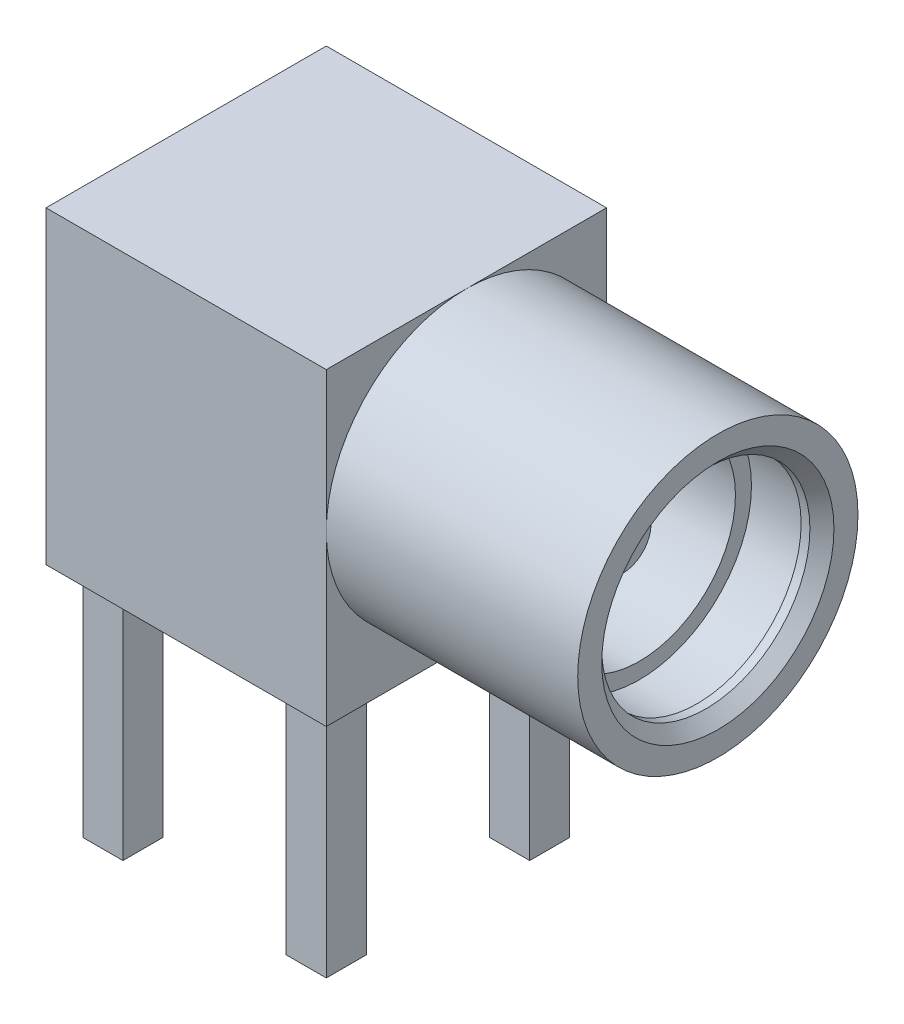
ISO-10303-21;
HEADER;
FILE_DESCRIPTION(('STEP AP214'),'2;1');
FILE_NAME('part.step','',(''),(''),'','','');
FILE_SCHEMA(('AUTOMOTIVE_DESIGN { 1 0 10303 214 1 1 1 1 }'));
ENDSEC;
DATA;
#1=APPLICATION_CONTEXT('core data for automotive mechanical design processes');
#2=APPLICATION_PROTOCOL_DEFINITION('international standard','automotive_design',2000,#1);
#3=PRODUCT_CONTEXT('',#1,'mechanical');
#4=PRODUCT('Part','Part','',(#3));
#5=PRODUCT_RELATED_PRODUCT_CATEGORY('part','',(#4));
#6=PRODUCT_DEFINITION_FORMATION('','',#4);
#7=PRODUCT_DEFINITION_CONTEXT('part definition',#1,'design');
#8=PRODUCT_DEFINITION('design','',#6,#7);
#9=PRODUCT_DEFINITION_SHAPE('','',#8);
#10=(LENGTH_UNIT() NAMED_UNIT(*) SI_UNIT(.MILLI.,.METRE.));
#11=(NAMED_UNIT(*) PLANE_ANGLE_UNIT() SI_UNIT($,.RADIAN.));
#12=(NAMED_UNIT(*) SI_UNIT($,.STERADIAN.) SOLID_ANGLE_UNIT());
#13=UNCERTAINTY_MEASURE_WITH_UNIT(LENGTH_MEASURE(1.E-05),#10,'distance_accuracy_value','');
#14=(GEOMETRIC_REPRESENTATION_CONTEXT(3) GLOBAL_UNCERTAINTY_ASSIGNED_CONTEXT((#13)) GLOBAL_UNIT_ASSIGNED_CONTEXT((#10,
#11,#12)) REPRESENTATION_CONTEXT('',''));
#15=CARTESIAN_POINT('',(0.,0.,0.));
#16=DIRECTION('',(0.,0.,1.));
#17=DIRECTION('',(1.,0.,0.));
#18=AXIS2_PLACEMENT_3D('',#15,#16,#17);
#19=CARTESIAN_POINT('',(41.5125000000001,-45.7600000000006,24.29));
#20=DIRECTION('',(0.,-1.,0.));
#21=DIRECTION('',(0.,0.,-1.));
#22=AXIS2_PLACEMENT_3D('',#19,#20,#21);
#23=PLANE('',#22);
#24=CARTESIAN_POINT('',(39.7625000000001,-45.7600000000006,22.54));
#25=DIRECTION('',(0.,-1.,0.));
#26=DIRECTION('',(0.,0.,-1.));
#27=AXIS2_PLACEMENT_3D('',#24,#25,#26);
#28=CIRCLE('',#27,0.355000000007009);
#29=CARTESIAN_POINT('',(39.7625000000001,-45.7600000000006,22.184999999993));
#30=VERTEX_POINT('',#29);
#31=EDGE_CURVE('E11',#30,#30,#28,.T.);
#32=ORIENTED_EDGE('',*,*,#31,.F.);
#33=EDGE_LOOP('',(#32));
#34=FACE_BOUND('',#33,.T.);
#35=DIRECTION('',(-1.,0.,0.));
#36=VECTOR('',#35,1.);
#37=CARTESIAN_POINT('',(41.5125000000001,-45.7600000000006,20.79));
#38=LINE('',#37,#36);
#39=CARTESIAN_POINT('',(41.5125000000001,-45.7600000000006,20.79));
#40=VERTEX_POINT('',#39);
#41=CARTESIAN_POINT('',(38.0125000000001,-45.7600000000006,20.79));
#42=VERTEX_POINT('',#41);
#43=EDGE_CURVE('E305',#40,#42,#38,.T.);
#44=ORIENTED_EDGE('',*,*,#43,.F.);
#45=DIRECTION('',(0.,0.,-1.));
#46=VECTOR('',#45,1.);
#47=CARTESIAN_POINT('',(41.5125000000001,-45.7600000000006,24.29));
#48=LINE('',#47,#46);
#49=CARTESIAN_POINT('',(41.5125000000001,-45.7600000000006,24.29));
#50=VERTEX_POINT('',#49);
#51=EDGE_CURVE('E328',#50,#40,#48,.T.);
#52=ORIENTED_EDGE('',*,*,#51,.F.);
#53=DIRECTION('',(-1.,0.,0.));
#54=VECTOR('',#53,1.);
#55=CARTESIAN_POINT('',(41.5125000000001,-45.7600000000006,24.29));
#56=LINE('',#55,#54);
#57=CARTESIAN_POINT('',(38.0125000000001,-45.7600000000006,24.29));
#58=VERTEX_POINT('',#57);
#59=EDGE_CURVE('E312',#50,#58,#56,.T.);
#60=ORIENTED_EDGE('',*,*,#59,.T.);
#61=DIRECTION('',(0.,0.,-1.));
#62=VECTOR('',#61,1.);
#63=CARTESIAN_POINT('',(38.0125000000001,-45.7600000000006,24.29));
#64=LINE('',#63,#62);
#65=EDGE_CURVE('E326',#58,#42,#64,.T.);
#66=ORIENTED_EDGE('',*,*,#65,.T.);
#67=EDGE_LOOP('',(#44,#52,#60,#66));
#68=FACE_BOUND('',#67,.T.);
#69=DIRECTION('',(0.,0.,-1.));
#70=VECTOR('',#69,1.);
#71=CARTESIAN_POINT('',(38.2425000000001,-45.7600000000006,23.56));
#72=LINE('',#71,#70);
#73=CARTESIAN_POINT('',(38.2425000000001,-45.7600000000006,24.06));
#74=VERTEX_POINT('',#73);
#75=CARTESIAN_POINT('',(38.2425000000001,-45.7600000000006,23.56));
#76=VERTEX_POINT('',#75);
#77=EDGE_CURVE('E278',#74,#76,#72,.T.);
#78=ORIENTED_EDGE('',*,*,#77,.F.);
#79=DIRECTION('',(-1.,0.,0.));
#80=VECTOR('',#79,1.);
#81=CARTESIAN_POINT('',(38.2425000000001,-45.7600000000006,24.06));
#82=LINE('',#81,#80);
#83=CARTESIAN_POINT('',(38.7425000000001,-45.7600000000006,24.06));
#84=VERTEX_POINT('',#83);
#85=EDGE_CURVE('E264',#84,#74,#82,.T.);
#86=ORIENTED_EDGE('',*,*,#85,.F.);
#87=DIRECTION('',(0.,0.,1.));
#88=VECTOR('',#87,1.);
#89=CARTESIAN_POINT('',(38.7425000000001,-45.7600000000006,24.06));
#90=LINE('',#89,#88);
#91=CARTESIAN_POINT('',(38.7425000000001,-45.7600000000006,23.56));
#92=VERTEX_POINT('',#91);
#93=EDGE_CURVE('E269',#92,#84,#90,.T.);
#94=ORIENTED_EDGE('',*,*,#93,.F.);
#95=DIRECTION('',(1.,0.,0.));
#96=VECTOR('',#95,1.);
#97=CARTESIAN_POINT('',(38.7425000000001,-45.7600000000006,23.56));
#98=LINE('',#97,#96);
#99=EDGE_CURVE('E280',#76,#92,#98,.T.);
#100=ORIENTED_EDGE('',*,*,#99,.F.);
#101=EDGE_LOOP('',(#78,#86,#94,#100));
#102=FACE_BOUND('',#101,.T.);
#103=DIRECTION('',(0.,0.,-1.));
#104=VECTOR('',#103,1.);
#105=CARTESIAN_POINT('',(40.7825000000001,-45.7600000000006,21.02));
#106=LINE('',#105,#104);
#107=CARTESIAN_POINT('',(40.7825000000001,-45.7600000000006,21.52));
#108=VERTEX_POINT('',#107);
#109=CARTESIAN_POINT('',(40.7825000000001,-45.7600000000006,21.02));
#110=VERTEX_POINT('',#109);
#111=EDGE_CURVE('E249',#108,#110,#106,.T.);
#112=ORIENTED_EDGE('',*,*,#111,.F.);
#113=DIRECTION('',(-1.,0.,0.));
#114=VECTOR('',#113,1.);
#115=CARTESIAN_POINT('',(40.7825000000001,-45.7600000000006,21.52));
#116=LINE('',#115,#114);
#117=CARTESIAN_POINT('',(41.2825000000001,-45.7600000000006,21.52));
#118=VERTEX_POINT('',#117);
#119=EDGE_CURVE('E235',#118,#108,#116,.T.);
#120=ORIENTED_EDGE('',*,*,#119,.F.);
#121=DIRECTION('',(0.,0.,1.));
#122=VECTOR('',#121,1.);
#123=CARTESIAN_POINT('',(41.2825000000001,-45.7600000000006,21.52));
#124=LINE('',#123,#122);
#125=CARTESIAN_POINT('',(41.2825000000001,-45.7600000000006,21.02));
#126=VERTEX_POINT('',#125);
#127=EDGE_CURVE('E240',#126,#118,#124,.T.);
#128=ORIENTED_EDGE('',*,*,#127,.F.);
#129=DIRECTION('',(1.,0.,0.));
#130=VECTOR('',#129,1.);
#131=CARTESIAN_POINT('',(41.2825000000001,-45.7600000000006,21.02));
#132=LINE('',#131,#130);
#133=EDGE_CURVE('E251',#110,#126,#132,.T.);
#134=ORIENTED_EDGE('',*,*,#133,.F.);
#135=EDGE_LOOP('',(#112,#120,#128,#134));
#136=FACE_BOUND('',#135,.T.);
#137=DIRECTION('',(0.,0.,-1.));
#138=VECTOR('',#137,1.);
#139=CARTESIAN_POINT('',(38.2425000000001,-45.7600000000006,21.02));
#140=LINE('',#139,#138);
#141=CARTESIAN_POINT('',(38.2425000000001,-45.7600000000006,21.52));
#142=VERTEX_POINT('',#141);
#143=CARTESIAN_POINT('',(38.2425000000001,-45.7600000000006,21.02));
#144=VERTEX_POINT('',#143);
#145=EDGE_CURVE('E207',#142,#144,#140,.T.);
#146=ORIENTED_EDGE('',*,*,#145,.F.);
#147=DIRECTION('',(-1.,0.,0.));
#148=VECTOR('',#147,1.);
#149=CARTESIAN_POINT('',(38.2425000000001,-45.7600000000006,21.52));
#150=LINE('',#149,#148);
#151=CARTESIAN_POINT('',(38.7425000000001,-45.7600000000006,21.52));
#152=VERTEX_POINT('',#151);
#153=EDGE_CURVE('E204',#152,#142,#150,.T.);
#154=ORIENTED_EDGE('',*,*,#153,.F.);
#155=DIRECTION('',(0.,0.,1.));
#156=VECTOR('',#155,1.);
#157=CARTESIAN_POINT('',(38.7425000000001,-45.7600000000006,21.52));
#158=LINE('',#157,#156);
#159=CARTESIAN_POINT('',(38.7425000000001,-45.7600000000006,21.02));
#160=VERTEX_POINT('',#159);
#161=EDGE_CURVE('E216',#160,#152,#158,.T.);
#162=ORIENTED_EDGE('',*,*,#161,.F.);
#163=DIRECTION('',(1.,0.,0.));
#164=VECTOR('',#163,1.);
#165=CARTESIAN_POINT('',(38.7425000000001,-45.7600000000006,21.02));
#166=LINE('',#165,#164);
#167=EDGE_CURVE('E224',#144,#160,#166,.T.);
#168=ORIENTED_EDGE('',*,*,#167,.F.);
#169=EDGE_LOOP('',(#146,#154,#162,#168));
#170=FACE_BOUND('',#169,.T.);
#171=DIRECTION('',(0.,0.,-1.));
#172=VECTOR('',#171,1.);
#173=CARTESIAN_POINT('',(40.7825000000001,-45.7600000000006,23.56));
#174=LINE('',#173,#172);
#175=CARTESIAN_POINT('',(40.7825000000001,-45.7600000000006,24.06));
#176=VERTEX_POINT('',#175);
#177=CARTESIAN_POINT('',(40.7825000000001,-45.7600000000006,23.56));
#178=VERTEX_POINT('',#177);
#179=EDGE_CURVE('E770',#176,#178,#174,.T.);
#180=ORIENTED_EDGE('',*,*,#179,.F.);
#181=DIRECTION('',(-1.,0.,0.));
#182=VECTOR('',#181,1.);
#183=CARTESIAN_POINT('',(40.7825000000001,-45.7600000000006,24.06));
#184=LINE('',#183,#182);
#185=CARTESIAN_POINT('',(41.2825000000001,-45.7600000000006,24.06));
#186=VERTEX_POINT('',#185);
#187=EDGE_CURVE('E202',#186,#176,#184,.T.);
#188=ORIENTED_EDGE('',*,*,#187,.F.);
#189=DIRECTION('',(0.,0.,1.));
#190=VECTOR('',#189,1.);
#191=CARTESIAN_POINT('',(41.2825000000001,-45.7600000000006,24.06));
#192=LINE('',#191,#190);
#193=CARTESIAN_POINT('',(41.2825000000001,-45.7600000000006,23.56));
#194=VERTEX_POINT('',#193);
#195=EDGE_CURVE('E198',#194,#186,#192,.T.);
#196=ORIENTED_EDGE('',*,*,#195,.F.);
#197=DIRECTION('',(1.,0.,0.));
#198=VECTOR('',#197,1.);
#199=CARTESIAN_POINT('',(41.2825000000001,-45.7600000000006,23.56));
#200=LINE('',#199,#198);
#201=EDGE_CURVE('E772',#178,#194,#200,.T.);
#202=ORIENTED_EDGE('',*,*,#201,.F.);
#203=EDGE_LOOP('',(#180,#188,#196,#202));
#204=FACE_BOUND('',#203,.T.);
#205=ADVANCED_FACE('F32',(#34,#68,#102,#136,#170,#204),#23,.T.);
#206=CARTESIAN_POINT('',(41.5125000000001,-41.9000000000005,24.29));
#207=DIRECTION('',(1.,0.,0.));
#208=DIRECTION('',(0.,0.,-1.));
#209=AXIS2_PLACEMENT_3D('',#206,#207,#208);
#210=PLANE('',#209);
#211=CARTESIAN_POINT('',(41.5125000000001,-43.6500000000006,22.54));
#212=DIRECTION('',(1.,0.,0.));
#213=DIRECTION('',(0.,0.,-1.));
#214=AXIS2_PLACEMENT_3D('',#211,#212,#213);
#215=CIRCLE('',#214,1.75);
#216=CARTESIAN_POINT('',(41.5125000000001,-43.6500000000006,20.79));
#217=VERTEX_POINT('',#216);
#218=CARTESIAN_POINT('',(41.5125000000001,-41.9000000000005,22.54));
#219=VERTEX_POINT('',#218);
#220=EDGE_CURVE('E293',#217,#219,#215,.T.);
#221=ORIENTED_EDGE('',*,*,#220,.F.);
#222=DIRECTION('',(0.,-1.,0.));
#223=VECTOR('',#222,1.);
#224=CARTESIAN_POINT('',(41.5125000000001,-41.9000000000005,20.79));
#225=LINE('',#224,#223);
#226=CARTESIAN_POINT('',(41.5125000000001,-41.9000000000005,20.79));
#227=VERTEX_POINT('',#226);
#228=EDGE_CURVE('E322',#227,#217,#225,.T.);
#229=ORIENTED_EDGE('',*,*,#228,.F.);
#230=DIRECTION('',(0.,0.,-1.));
#231=VECTOR('',#230,1.);
#232=CARTESIAN_POINT('',(41.5125000000001,-41.9000000000005,24.29));
#233=LINE('',#232,#231);
#234=EDGE_CURVE('E333',#219,#227,#233,.T.);
#235=ORIENTED_EDGE('',*,*,#234,.F.);
#236=EDGE_LOOP('',(#221,#229,#235));
#237=FACE_BOUND('',#236,.T.);
#238=ADVANCED_FACE('F343',(#237),#210,.T.);
#239=CARTESIAN_POINT('',(41.5125000000001,-43.6500000000006,24.29));
#240=VERTEX_POINT('',#239);
#241=EDGE_CURVE('E40',#219,#240,#215,.T.);
#242=ORIENTED_EDGE('',*,*,#241,.F.);
#243=CARTESIAN_POINT('',(41.5125000000001,-41.9000000000005,24.29));
#244=VERTEX_POINT('',#243);
#245=EDGE_CURVE('E331',#244,#219,#233,.T.);
#246=ORIENTED_EDGE('',*,*,#245,.F.);
#247=DIRECTION('',(0.,-1.,0.));
#248=VECTOR('',#247,1.);
#249=CARTESIAN_POINT('',(41.5125000000001,-41.9000000000005,24.29));
#250=LINE('',#249,#248);
#251=EDGE_CURVE('E309',#244,#240,#250,.T.);
#252=ORIENTED_EDGE('',*,*,#251,.T.);
#253=EDGE_LOOP('',(#242,#246,#252));
#254=FACE_BOUND('',#253,.T.);
#255=ADVANCED_FACE('F363',(#254),#210,.T.);
#256=CARTESIAN_POINT('',(38.0125000000001,-45.7600000000006,24.29));
#257=DIRECTION('',(-1.,0.,0.));
#258=DIRECTION('',(0.,0.,1.));
#259=AXIS2_PLACEMENT_3D('',#256,#257,#258);
#260=PLANE('',#259);
#261=DIRECTION('',(0.,1.,0.));
#262=VECTOR('',#261,1.);
#263=CARTESIAN_POINT('',(38.0125000000001,-45.7600000000006,20.79));
#264=LINE('',#263,#262);
#265=CARTESIAN_POINT('',(38.0125000000001,-41.9000000000005,20.79));
#266=VERTEX_POINT('',#265);
#267=EDGE_CURVE('E297',#42,#266,#264,.T.);
#268=ORIENTED_EDGE('',*,*,#267,.F.);
#269=ORIENTED_EDGE('',*,*,#65,.F.);
#270=DIRECTION('',(0.,1.,0.));
#271=VECTOR('',#270,1.);
#272=CARTESIAN_POINT('',(38.0125000000001,-45.7600000000006,24.29));
#273=LINE('',#272,#271);
#274=CARTESIAN_POINT('',(38.0125000000001,-41.9000000000005,24.29));
#275=VERTEX_POINT('',#274);
#276=EDGE_CURVE('E301',#58,#275,#273,.T.);
#277=ORIENTED_EDGE('',*,*,#276,.T.);
#278=DIRECTION('',(0.,0.,-1.));
#279=VECTOR('',#278,1.);
#280=CARTESIAN_POINT('',(38.0125000000001,-41.9000000000005,24.29));
#281=LINE('',#280,#279);
#282=EDGE_CURVE('E315',#275,#266,#281,.T.);
#283=ORIENTED_EDGE('',*,*,#282,.T.);
#284=EDGE_LOOP('',(#268,#269,#277,#283));
#285=FACE_BOUND('',#284,.T.);
#286=ADVANCED_FACE('F34',(#285),#260,.T.);
#287=EDGE_CURVE('E300',#240,#217,#215,.T.);
#288=ORIENTED_EDGE('',*,*,#287,.F.);
#289=EDGE_CURVE('E308',#240,#50,#250,.T.);
#290=ORIENTED_EDGE('',*,*,#289,.T.);
#291=ORIENTED_EDGE('',*,*,#51,.T.);
#292=EDGE_CURVE('E321',#217,#40,#225,.T.);
#293=ORIENTED_EDGE('',*,*,#292,.F.);
#294=EDGE_LOOP('',(#288,#290,#291,#293));
#295=FACE_BOUND('',#294,.T.);
#296=ADVANCED_FACE('F360',(#295),#210,.T.);
#297=CARTESIAN_POINT('',(38.0125000000001,-41.9000000000005,24.29));
#298=DIRECTION('',(0.,1.,0.));
#299=DIRECTION('',(0.,0.,1.));
#300=AXIS2_PLACEMENT_3D('',#297,#298,#299);
#301=PLANE('',#300);
#302=DIRECTION('',(1.,0.,0.));
#303=VECTOR('',#302,1.);
#304=CARTESIAN_POINT('',(38.0125000000001,-41.9000000000005,20.79));
#305=LINE('',#304,#303);
#306=EDGE_CURVE('E318',#266,#227,#305,.T.);
#307=ORIENTED_EDGE('',*,*,#306,.F.);
#308=ORIENTED_EDGE('',*,*,#282,.F.);
#309=DIRECTION('',(1.,0.,0.));
#310=VECTOR('',#309,1.);
#311=CARTESIAN_POINT('',(38.0125000000001,-41.9000000000005,24.29));
#312=LINE('',#311,#310);
#313=EDGE_CURVE('E304',#275,#244,#312,.T.);
#314=ORIENTED_EDGE('',*,*,#313,.T.);
#315=ORIENTED_EDGE('',*,*,#245,.T.);
#316=ORIENTED_EDGE('',*,*,#234,.T.);
#317=EDGE_LOOP('',(#307,#308,#314,#315,#316));
#318=FACE_BOUND('',#317,.T.);
#319=ADVANCED_FACE('F340',(#318),#301,.T.);
#320=CARTESIAN_POINT('',(0.,0.,24.2900000000001));
#321=DIRECTION('',(0.,0.,-1.));
#322=DIRECTION('',(-1.,0.,0.));
#323=AXIS2_PLACEMENT_3D('',#320,#321,#322);
#324=PLANE('',#323);
#325=ORIENTED_EDGE('',*,*,#276,.F.);
#326=ORIENTED_EDGE('',*,*,#59,.F.);
#327=ORIENTED_EDGE('',*,*,#289,.F.);
#328=ORIENTED_EDGE('',*,*,#251,.F.);
#329=ORIENTED_EDGE('',*,*,#313,.F.);
#330=EDGE_LOOP('',(#325,#326,#327,#328,#329));
#331=FACE_BOUND('',#330,.T.);
#332=ADVANCED_FACE('F354',(#331),#324,.F.);
#333=CARTESIAN_POINT('',(0.,0.,20.7900000000001));
#334=DIRECTION('',(0.,0.,-1.));
#335=DIRECTION('',(-1.,0.,0.));
#336=AXIS2_PLACEMENT_3D('',#333,#334,#335);
#337=PLANE('',#336);
#338=ORIENTED_EDGE('',*,*,#267,.T.);
#339=ORIENTED_EDGE('',*,*,#306,.T.);
#340=ORIENTED_EDGE('',*,*,#228,.T.);
#341=ORIENTED_EDGE('',*,*,#292,.T.);
#342=ORIENTED_EDGE('',*,*,#43,.T.);
#343=EDGE_LOOP('',(#338,#339,#340,#341,#342));
#344=FACE_BOUND('',#343,.T.);
#345=ADVANCED_FACE('F347',(#344),#337,.T.);
#346=CARTESIAN_POINT('',(44.6525000000001,-43.6500000000006,22.54));
#347=DIRECTION('',(-1.,0.,0.));
#348=DIRECTION('',(0.,0.,1.));
#349=AXIS2_PLACEMENT_3D('',#346,#347,#348);
#350=CYLINDRICAL_SURFACE('',#349,1.75);
#351=CARTESIAN_POINT('',(44.6525000000001,-43.6500000000006,22.54));
#352=DIRECTION('',(1.,0.,0.));
#353=DIRECTION('',(0.,0.,-1.));
#354=AXIS2_PLACEMENT_3D('',#351,#352,#353);
#355=CIRCLE('',#354,1.75);
#356=CARTESIAN_POINT('',(44.6525000000001,-43.6500000000006,20.79));
#357=VERTEX_POINT('',#356);
#358=EDGE_CURVE('E294',#357,#357,#355,.T.);
#359=ORIENTED_EDGE('',*,*,#358,.F.);
#360=EDGE_LOOP('',(#359));
#361=FACE_BOUND('',#360,.T.);
#362=ORIENTED_EDGE('',*,*,#220,.T.);
#363=ORIENTED_EDGE('',*,*,#241,.T.);
#364=ORIENTED_EDGE('',*,*,#287,.T.);
#365=EDGE_LOOP('',(#362,#363,#364));
#366=FACE_BOUND('',#365,.T.);
#367=ADVANCED_FACE('F365',(#361,#366),#350,.T.);
#368=CARTESIAN_POINT('',(44.6525000000001,-43.6500000000006,22.54));
#369=DIRECTION('',(1.,0.,0.));
#370=DIRECTION('',(0.,0.,-1.));
#371=AXIS2_PLACEMENT_3D('',#368,#369,#370);
#372=PLANE('',#371);
#373=CARTESIAN_POINT('',(44.6524999999915,-43.6500000000006,22.54));
#374=DIRECTION('',(1.,0.,0.));
#375=DIRECTION('',(0.,0.,-1.));
#376=AXIS2_PLACEMENT_3D('',#373,#374,#375);
#377=CIRCLE('',#376,1.45000000002696);
#378=CARTESIAN_POINT('',(44.6524999999915,-43.6500000000006,21.089999999973));
#379=VERTEX_POINT('',#378);
#380=EDGE_CURVE('E754',#379,#379,#377,.T.);
#381=ORIENTED_EDGE('',*,*,#380,.F.);
#382=EDGE_LOOP('',(#381));
#383=FACE_BOUND('',#382,.T.);
#384=ORIENTED_EDGE('',*,*,#358,.T.);
#385=EDGE_LOOP('',(#384));
#386=FACE_BOUND('',#385,.T.);
#387=ADVANCED_FACE('F367',(#383,#386),#372,.T.);
#388=CARTESIAN_POINT('',(38.2425000000001,-48.7100000000006,24.06));
#389=DIRECTION('',(0.,0.,-1.));
#390=DIRECTION('',(-1.,0.,0.));
#391=AXIS2_PLACEMENT_3D('',#388,#389,#390);
#392=PLANE('',#391);
#393=ORIENTED_EDGE('',*,*,#85,.T.);
#394=DIRECTION('',(0.,1.,0.));
#395=VECTOR('',#394,1.);
#396=CARTESIAN_POINT('',(38.2425000000001,-48.7100000000006,24.06));
#397=LINE('',#396,#395);
#398=CARTESIAN_POINT('',(38.2425000000001,-48.7100000000006,24.06));
#399=VERTEX_POINT('',#398);
#400=EDGE_CURVE('E291',#399,#74,#397,.T.);
#401=ORIENTED_EDGE('',*,*,#400,.F.);
#402=DIRECTION('',(-1.,0.,0.));
#403=VECTOR('',#402,1.);
#404=CARTESIAN_POINT('',(38.2425000000001,-48.7100000000006,24.06));
#405=LINE('',#404,#403);
#406=CARTESIAN_POINT('',(38.7425000000001,-48.7100000000006,24.06));
#407=VERTEX_POINT('',#406);
#408=EDGE_CURVE('E265',#407,#399,#405,.T.);
#409=ORIENTED_EDGE('',*,*,#408,.F.);
#410=DIRECTION('',(0.,1.,0.));
#411=VECTOR('',#410,1.);
#412=CARTESIAN_POINT('',(38.7425000000001,-48.7100000000006,24.06));
#413=LINE('',#412,#411);
#414=EDGE_CURVE('E275',#407,#84,#413,.T.);
#415=ORIENTED_EDGE('',*,*,#414,.T.);
#416=EDGE_LOOP('',(#393,#401,#409,#415));
#417=FACE_BOUND('',#416,.T.);
#418=ADVANCED_FACE('F374',(#417),#392,.F.);
#419=CARTESIAN_POINT('',(38.2425000000001,-48.7100000000006,23.56));
#420=DIRECTION('',(1.,0.,0.));
#421=DIRECTION('',(0.,0.,-1.));
#422=AXIS2_PLACEMENT_3D('',#419,#420,#421);
#423=PLANE('',#422);
#424=ORIENTED_EDGE('',*,*,#77,.T.);
#425=DIRECTION('',(0.,1.,0.));
#426=VECTOR('',#425,1.);
#427=CARTESIAN_POINT('',(38.2425000000001,-48.7100000000006,23.56));
#428=LINE('',#427,#426);
#429=CARTESIAN_POINT('',(38.2425000000001,-48.7100000000006,23.56));
#430=VERTEX_POINT('',#429);
#431=EDGE_CURVE('E288',#430,#76,#428,.T.);
#432=ORIENTED_EDGE('',*,*,#431,.F.);
#433=DIRECTION('',(0.,0.,-1.));
#434=VECTOR('',#433,1.);
#435=CARTESIAN_POINT('',(38.2425000000001,-48.7100000000006,23.56));
#436=LINE('',#435,#434);
#437=EDGE_CURVE('E268',#399,#430,#436,.T.);
#438=ORIENTED_EDGE('',*,*,#437,.F.);
#439=ORIENTED_EDGE('',*,*,#400,.T.);
#440=EDGE_LOOP('',(#424,#432,#438,#439));
#441=FACE_BOUND('',#440,.T.);
#442=ADVANCED_FACE('F415',(#441),#423,.F.);
#443=CARTESIAN_POINT('',(38.7425000000001,-48.7100000000006,23.56));
#444=DIRECTION('',(0.,0.,1.));
#445=DIRECTION('',(1.,0.,0.));
#446=AXIS2_PLACEMENT_3D('',#443,#444,#445);
#447=PLANE('',#446);
#448=ORIENTED_EDGE('',*,*,#99,.T.);
#449=DIRECTION('',(0.,1.,0.));
#450=VECTOR('',#449,1.);
#451=CARTESIAN_POINT('',(38.7425000000001,-48.7100000000006,23.56));
#452=LINE('',#451,#450);
#453=CARTESIAN_POINT('',(38.7425000000001,-48.7100000000006,23.56));
#454=VERTEX_POINT('',#453);
#455=EDGE_CURVE('E286',#454,#92,#452,.T.);
#456=ORIENTED_EDGE('',*,*,#455,.F.);
#457=DIRECTION('',(1.,0.,0.));
#458=VECTOR('',#457,1.);
#459=CARTESIAN_POINT('',(38.7425000000001,-48.7100000000006,23.56));
#460=LINE('',#459,#458);
#461=EDGE_CURVE('E271',#430,#454,#460,.T.);
#462=ORIENTED_EDGE('',*,*,#461,.F.);
#463=ORIENTED_EDGE('',*,*,#431,.T.);
#464=EDGE_LOOP('',(#448,#456,#462,#463));
#465=FACE_BOUND('',#464,.T.);
#466=ADVANCED_FACE('F425',(#465),#447,.F.);
#467=CARTESIAN_POINT('',(38.7425000000001,-48.7100000000006,24.06));
#468=DIRECTION('',(-1.,0.,0.));
#469=DIRECTION('',(0.,0.,1.));
#470=AXIS2_PLACEMENT_3D('',#467,#468,#469);
#471=PLANE('',#470);
#472=ORIENTED_EDGE('',*,*,#93,.T.);
#473=ORIENTED_EDGE('',*,*,#414,.F.);
#474=DIRECTION('',(0.,0.,1.));
#475=VECTOR('',#474,1.);
#476=CARTESIAN_POINT('',(38.7425000000001,-48.7100000000006,24.06));
#477=LINE('',#476,#475);
#478=EDGE_CURVE('E273',#454,#407,#477,.T.);
#479=ORIENTED_EDGE('',*,*,#478,.F.);
#480=ORIENTED_EDGE('',*,*,#455,.T.);
#481=EDGE_LOOP('',(#472,#473,#479,#480));
#482=FACE_BOUND('',#481,.T.);
#483=ADVANCED_FACE('F435',(#482),#471,.F.);
#484=CARTESIAN_POINT('',(0.,-48.7100000000006,0.));
#485=DIRECTION('',(0.,1.,0.));
#486=DIRECTION('',(0.,0.,1.));
#487=AXIS2_PLACEMENT_3D('',#484,#485,#486);
#488=PLANE('',#487);
#489=ORIENTED_EDGE('',*,*,#408,.T.);
#490=ORIENTED_EDGE('',*,*,#437,.T.);
#491=ORIENTED_EDGE('',*,*,#461,.T.);
#492=ORIENTED_EDGE('',*,*,#478,.T.);
#493=EDGE_LOOP('',(#489,#490,#491,#492));
#494=FACE_BOUND('',#493,.T.);
#495=ADVANCED_FACE('F445',(#494),#488,.F.);
#496=CARTESIAN_POINT('',(40.7825000000001,-48.7100000000006,21.52));
#497=DIRECTION('',(0.,0.,-1.));
#498=DIRECTION('',(-1.,0.,0.));
#499=AXIS2_PLACEMENT_3D('',#496,#497,#498);
#500=PLANE('',#499);
#501=ORIENTED_EDGE('',*,*,#119,.T.);
#502=DIRECTION('',(0.,1.,0.));
#503=VECTOR('',#502,1.);
#504=CARTESIAN_POINT('',(40.7825000000001,-48.7100000000006,21.52));
#505=LINE('',#504,#503);
#506=CARTESIAN_POINT('',(40.7825000000001,-48.7100000000006,21.52));
#507=VERTEX_POINT('',#506);
#508=EDGE_CURVE('E262',#507,#108,#505,.T.);
#509=ORIENTED_EDGE('',*,*,#508,.F.);
#510=DIRECTION('',(-1.,0.,0.));
#511=VECTOR('',#510,1.);
#512=CARTESIAN_POINT('',(40.7825000000001,-48.7100000000006,21.52));
#513=LINE('',#512,#511);
#514=CARTESIAN_POINT('',(41.2825000000001,-48.7100000000006,21.52));
#515=VERTEX_POINT('',#514);
#516=EDGE_CURVE('E236',#515,#507,#513,.T.);
#517=ORIENTED_EDGE('',*,*,#516,.F.);
#518=DIRECTION('',(0.,1.,0.));
#519=VECTOR('',#518,1.);
#520=CARTESIAN_POINT('',(41.2825000000001,-48.7100000000006,21.52));
#521=LINE('',#520,#519);
#522=EDGE_CURVE('E246',#515,#118,#521,.T.);
#523=ORIENTED_EDGE('',*,*,#522,.T.);
#524=EDGE_LOOP('',(#501,#509,#517,#523));
#525=FACE_BOUND('',#524,.T.);
#526=ADVANCED_FACE('F455',(#525),#500,.F.);
#527=CARTESIAN_POINT('',(40.7825000000001,-48.7100000000006,21.02));
#528=DIRECTION('',(1.,0.,0.));
#529=DIRECTION('',(0.,0.,-1.));
#530=AXIS2_PLACEMENT_3D('',#527,#528,#529);
#531=PLANE('',#530);
#532=ORIENTED_EDGE('',*,*,#111,.T.);
#533=DIRECTION('',(0.,1.,0.));
#534=VECTOR('',#533,1.);
#535=CARTESIAN_POINT('',(40.7825000000001,-48.7100000000006,21.02));
#536=LINE('',#535,#534);
#537=CARTESIAN_POINT('',(40.7825000000001,-48.7100000000006,21.02));
#538=VERTEX_POINT('',#537);
#539=EDGE_CURVE('E259',#538,#110,#536,.T.);
#540=ORIENTED_EDGE('',*,*,#539,.F.);
#541=DIRECTION('',(0.,0.,-1.));
#542=VECTOR('',#541,1.);
#543=CARTESIAN_POINT('',(40.7825000000001,-48.7100000000006,21.02));
#544=LINE('',#543,#542);
#545=EDGE_CURVE('E239',#507,#538,#544,.T.);
#546=ORIENTED_EDGE('',*,*,#545,.F.);
#547=ORIENTED_EDGE('',*,*,#508,.T.);
#548=EDGE_LOOP('',(#532,#540,#546,#547));
#549=FACE_BOUND('',#548,.T.);
#550=ADVANCED_FACE('F465',(#549),#531,.F.);
#551=CARTESIAN_POINT('',(41.2825000000001,-48.7100000000006,21.02));
#552=DIRECTION('',(0.,0.,1.));
#553=DIRECTION('',(1.,0.,0.));
#554=AXIS2_PLACEMENT_3D('',#551,#552,#553);
#555=PLANE('',#554);
#556=ORIENTED_EDGE('',*,*,#133,.T.);
#557=DIRECTION('',(0.,1.,0.));
#558=VECTOR('',#557,1.);
#559=CARTESIAN_POINT('',(41.2825000000001,-48.7100000000006,21.02));
#560=LINE('',#559,#558);
#561=CARTESIAN_POINT('',(41.2825000000001,-48.7100000000006,21.02));
#562=VERTEX_POINT('',#561);
#563=EDGE_CURVE('E257',#562,#126,#560,.T.);
#564=ORIENTED_EDGE('',*,*,#563,.F.);
#565=DIRECTION('',(1.,0.,0.));
#566=VECTOR('',#565,1.);
#567=CARTESIAN_POINT('',(41.2825000000001,-48.7100000000006,21.02));
#568=LINE('',#567,#566);
#569=EDGE_CURVE('E242',#538,#562,#568,.T.);
#570=ORIENTED_EDGE('',*,*,#569,.F.);
#571=ORIENTED_EDGE('',*,*,#539,.T.);
#572=EDGE_LOOP('',(#556,#564,#570,#571));
#573=FACE_BOUND('',#572,.T.);
#574=ADVANCED_FACE('F475',(#573),#555,.F.);
#575=CARTESIAN_POINT('',(41.2825000000001,-48.7100000000006,21.52));
#576=DIRECTION('',(-1.,0.,0.));
#577=DIRECTION('',(0.,0.,1.));
#578=AXIS2_PLACEMENT_3D('',#575,#576,#577);
#579=PLANE('',#578);
#580=ORIENTED_EDGE('',*,*,#127,.T.);
#581=ORIENTED_EDGE('',*,*,#522,.F.);
#582=DIRECTION('',(0.,0.,1.));
#583=VECTOR('',#582,1.);
#584=CARTESIAN_POINT('',(41.2825000000001,-48.7100000000006,21.52));
#585=LINE('',#584,#583);
#586=EDGE_CURVE('E244',#562,#515,#585,.T.);
#587=ORIENTED_EDGE('',*,*,#586,.F.);
#588=ORIENTED_EDGE('',*,*,#563,.T.);
#589=EDGE_LOOP('',(#580,#581,#587,#588));
#590=FACE_BOUND('',#589,.T.);
#591=ADVANCED_FACE('F485',(#590),#579,.F.);
#592=CARTESIAN_POINT('',(0.,-48.7100000000006,0.));
#593=DIRECTION('',(0.,1.,0.));
#594=DIRECTION('',(0.,0.,1.));
#595=AXIS2_PLACEMENT_3D('',#592,#593,#594);
#596=PLANE('',#595);
#597=ORIENTED_EDGE('',*,*,#516,.T.);
#598=ORIENTED_EDGE('',*,*,#545,.T.);
#599=ORIENTED_EDGE('',*,*,#569,.T.);
#600=ORIENTED_EDGE('',*,*,#586,.T.);
#601=EDGE_LOOP('',(#597,#598,#599,#600));
#602=FACE_BOUND('',#601,.T.);
#603=ADVANCED_FACE('F495',(#602),#596,.F.);
#604=CARTESIAN_POINT('',(38.2425000000001,-48.7100000000006,21.52));
#605=DIRECTION('',(0.,0.,-1.));
#606=DIRECTION('',(-1.,0.,0.));
#607=AXIS2_PLACEMENT_3D('',#604,#605,#606);
#608=PLANE('',#607);
#609=ORIENTED_EDGE('',*,*,#153,.T.);
#610=DIRECTION('',(0.,1.,0.));
#611=VECTOR('',#610,1.);
#612=CARTESIAN_POINT('',(38.2425000000001,-48.7100000000006,21.52));
#613=LINE('',#612,#611);
#614=CARTESIAN_POINT('',(38.2425000000001,-48.7100000000006,21.52));
#615=VERTEX_POINT('',#614);
#616=EDGE_CURVE('E233',#615,#142,#613,.T.);
#617=ORIENTED_EDGE('',*,*,#616,.F.);
#618=DIRECTION('',(-1.,0.,0.));
#619=VECTOR('',#618,1.);
#620=CARTESIAN_POINT('',(38.2425000000001,-48.7100000000006,21.52));
#621=LINE('',#620,#619);
#622=CARTESIAN_POINT('',(38.7425000000001,-48.7100000000006,21.52));
#623=VERTEX_POINT('',#622);
#624=EDGE_CURVE('E212',#623,#615,#621,.T.);
#625=ORIENTED_EDGE('',*,*,#624,.F.);
#626=DIRECTION('',(0.,1.,0.));
#627=VECTOR('',#626,1.);
#628=CARTESIAN_POINT('',(38.7425000000001,-48.7100000000006,21.52));
#629=LINE('',#628,#627);
#630=EDGE_CURVE('E221',#623,#152,#629,.T.);
#631=ORIENTED_EDGE('',*,*,#630,.T.);
#632=EDGE_LOOP('',(#609,#617,#625,#631));
#633=FACE_BOUND('',#632,.T.);
#634=ADVANCED_FACE('F505',(#633),#608,.F.);
#635=CARTESIAN_POINT('',(38.2425000000001,-48.7100000000006,21.02));
#636=DIRECTION('',(1.,0.,0.));
#637=DIRECTION('',(0.,0.,-1.));
#638=AXIS2_PLACEMENT_3D('',#635,#636,#637);
#639=PLANE('',#638);
#640=ORIENTED_EDGE('',*,*,#145,.T.);
#641=DIRECTION('',(0.,1.,0.));
#642=VECTOR('',#641,1.);
#643=CARTESIAN_POINT('',(38.2425000000001,-48.7100000000006,21.02));
#644=LINE('',#643,#642);
#645=CARTESIAN_POINT('',(38.2425000000001,-48.7100000000006,21.02));
#646=VERTEX_POINT('',#645);
#647=EDGE_CURVE('E230',#646,#144,#644,.T.);
#648=ORIENTED_EDGE('',*,*,#647,.F.);
#649=DIRECTION('',(0.,0.,-1.));
#650=VECTOR('',#649,1.);
#651=CARTESIAN_POINT('',(38.2425000000001,-48.7100000000006,21.02));
#652=LINE('',#651,#650);
#653=EDGE_CURVE('E215',#615,#646,#652,.T.);
#654=ORIENTED_EDGE('',*,*,#653,.F.);
#655=ORIENTED_EDGE('',*,*,#616,.T.);
#656=EDGE_LOOP('',(#640,#648,#654,#655));
#657=FACE_BOUND('',#656,.T.);
#658=ADVANCED_FACE('F515',(#657),#639,.F.);
#659=CARTESIAN_POINT('',(38.7425000000001,-48.7100000000006,21.02));
#660=DIRECTION('',(0.,0.,1.));
#661=DIRECTION('',(1.,0.,0.));
#662=AXIS2_PLACEMENT_3D('',#659,#660,#661);
#663=PLANE('',#662);
#664=ORIENTED_EDGE('',*,*,#167,.T.);
#665=DIRECTION('',(0.,1.,0.));
#666=VECTOR('',#665,1.);
#667=CARTESIAN_POINT('',(38.7425000000001,-48.7100000000006,21.02));
#668=LINE('',#667,#666);
#669=CARTESIAN_POINT('',(38.7425000000001,-48.7100000000006,21.02));
#670=VERTEX_POINT('',#669);
#671=EDGE_CURVE('E55',#670,#160,#668,.T.);
#672=ORIENTED_EDGE('',*,*,#671,.F.);
#673=DIRECTION('',(1.,0.,0.));
#674=VECTOR('',#673,1.);
#675=CARTESIAN_POINT('',(38.7425000000001,-48.7100000000006,21.02));
#676=LINE('',#675,#674);
#677=EDGE_CURVE('E218',#646,#670,#676,.T.);
#678=ORIENTED_EDGE('',*,*,#677,.F.);
#679=ORIENTED_EDGE('',*,*,#647,.T.);
#680=EDGE_LOOP('',(#664,#672,#678,#679));
#681=FACE_BOUND('',#680,.T.);
#682=ADVANCED_FACE('F525',(#681),#663,.F.);
#683=CARTESIAN_POINT('',(38.7425000000001,-48.7100000000006,21.52));
#684=DIRECTION('',(-1.,0.,0.));
#685=DIRECTION('',(0.,0.,1.));
#686=AXIS2_PLACEMENT_3D('',#683,#684,#685);
#687=PLANE('',#686);
#688=ORIENTED_EDGE('',*,*,#161,.T.);
#689=ORIENTED_EDGE('',*,*,#630,.F.);
#690=DIRECTION('',(0.,0.,1.));
#691=VECTOR('',#690,1.);
#692=CARTESIAN_POINT('',(38.7425000000001,-48.7100000000006,21.52));
#693=LINE('',#692,#691);
#694=EDGE_CURVE('E220',#670,#623,#693,.T.);
#695=ORIENTED_EDGE('',*,*,#694,.F.);
#696=ORIENTED_EDGE('',*,*,#671,.T.);
#697=EDGE_LOOP('',(#688,#689,#695,#696));
#698=FACE_BOUND('',#697,.T.);
#699=ADVANCED_FACE('F535',(#698),#687,.F.);
#700=CARTESIAN_POINT('',(0.,-48.7100000000006,0.));
#701=DIRECTION('',(0.,1.,0.));
#702=DIRECTION('',(0.,0.,1.));
#703=AXIS2_PLACEMENT_3D('',#700,#701,#702);
#704=PLANE('',#703);
#705=ORIENTED_EDGE('',*,*,#624,.T.);
#706=ORIENTED_EDGE('',*,*,#653,.T.);
#707=ORIENTED_EDGE('',*,*,#677,.T.);
#708=ORIENTED_EDGE('',*,*,#694,.T.);
#709=EDGE_LOOP('',(#705,#706,#707,#708));
#710=FACE_BOUND('',#709,.T.);
#711=ADVANCED_FACE('F545',(#710),#704,.F.);
#712=CARTESIAN_POINT('',(40.7825000000001,-48.7100000000006,24.06));
#713=DIRECTION('',(0.,0.,-1.));
#714=DIRECTION('',(-1.,0.,0.));
#715=AXIS2_PLACEMENT_3D('',#712,#713,#714);
#716=PLANE('',#715);
#717=ORIENTED_EDGE('',*,*,#187,.T.);
#718=DIRECTION('',(0.,1.,0.));
#719=VECTOR('',#718,1.);
#720=CARTESIAN_POINT('',(40.7825000000001,-48.7100000000006,24.06));
#721=LINE('',#720,#719);
#722=CARTESIAN_POINT('',(40.7825000000001,-48.7100000000006,24.06));
#723=VERTEX_POINT('',#722);
#724=EDGE_CURVE('E183',#723,#176,#721,.T.);
#725=ORIENTED_EDGE('',*,*,#724,.F.);
#726=DIRECTION('',(-1.,0.,0.));
#727=VECTOR('',#726,1.);
#728=CARTESIAN_POINT('',(40.7825000000001,-48.7100000000006,24.06));
#729=LINE('',#728,#727);
#730=CARTESIAN_POINT('',(41.2825000000001,-48.7100000000006,24.06));
#731=VERTEX_POINT('',#730);
#732=EDGE_CURVE('E190',#731,#723,#729,.T.);
#733=ORIENTED_EDGE('',*,*,#732,.F.);
#734=DIRECTION('',(0.,1.,0.));
#735=VECTOR('',#734,1.);
#736=CARTESIAN_POINT('',(41.2825000000001,-48.7100000000006,24.06));
#737=LINE('',#736,#735);
#738=EDGE_CURVE('E768',#731,#186,#737,.T.);
#739=ORIENTED_EDGE('',*,*,#738,.T.);
#740=EDGE_LOOP('',(#717,#725,#733,#739));
#741=FACE_BOUND('',#740,.T.);
#742=ADVANCED_FACE('F200',(#741),#716,.F.);
#743=CARTESIAN_POINT('',(40.7825000000001,-48.7100000000006,23.56));
#744=DIRECTION('',(1.,0.,0.));
#745=DIRECTION('',(0.,0.,-1.));
#746=AXIS2_PLACEMENT_3D('',#743,#744,#745);
#747=PLANE('',#746);
#748=ORIENTED_EDGE('',*,*,#179,.T.);
#749=DIRECTION('',(0.,1.,0.));
#750=VECTOR('',#749,1.);
#751=CARTESIAN_POINT('',(40.7825000000001,-48.7100000000006,23.56));
#752=LINE('',#751,#750);
#753=CARTESIAN_POINT('',(40.7825000000001,-48.7100000000006,23.56));
#754=VERTEX_POINT('',#753);
#755=EDGE_CURVE('E186',#754,#178,#752,.T.);
#756=ORIENTED_EDGE('',*,*,#755,.F.);
#757=DIRECTION('',(0.,0.,-1.));
#758=VECTOR('',#757,1.);
#759=CARTESIAN_POINT('',(40.7825000000001,-48.7100000000006,23.56));
#760=LINE('',#759,#758);
#761=EDGE_CURVE('E179',#723,#754,#760,.T.);
#762=ORIENTED_EDGE('',*,*,#761,.F.);
#763=ORIENTED_EDGE('',*,*,#724,.T.);
#764=EDGE_LOOP('',(#748,#756,#762,#763));
#765=FACE_BOUND('',#764,.T.);
#766=ADVANCED_FACE('F181',(#765),#747,.F.);
#767=CARTESIAN_POINT('',(41.2825000000001,-48.7100000000006,23.56));
#768=DIRECTION('',(0.,0.,1.));
#769=DIRECTION('',(1.,0.,0.));
#770=AXIS2_PLACEMENT_3D('',#767,#768,#769);
#771=PLANE('',#770);
#772=ORIENTED_EDGE('',*,*,#201,.T.);
#773=DIRECTION('',(0.,1.,0.));
#774=VECTOR('',#773,1.);
#775=CARTESIAN_POINT('',(41.2825000000001,-48.7100000000006,23.56));
#776=LINE('',#775,#774);
#777=CARTESIAN_POINT('',(41.2825000000001,-48.7100000000006,23.56));
#778=VERTEX_POINT('',#777);
#779=EDGE_CURVE('E47',#778,#194,#776,.T.);
#780=ORIENTED_EDGE('',*,*,#779,.F.);
#781=DIRECTION('',(1.,0.,0.));
#782=VECTOR('',#781,1.);
#783=CARTESIAN_POINT('',(41.2825000000001,-48.7100000000006,23.56));
#784=LINE('',#783,#782);
#785=EDGE_CURVE('E189',#754,#778,#784,.T.);
#786=ORIENTED_EDGE('',*,*,#785,.F.);
#787=ORIENTED_EDGE('',*,*,#755,.T.);
#788=EDGE_LOOP('',(#772,#780,#786,#787));
#789=FACE_BOUND('',#788,.T.);
#790=ADVANCED_FACE('F572',(#789),#771,.F.);
#791=CARTESIAN_POINT('',(41.2825000000001,-48.7100000000006,24.06));
#792=DIRECTION('',(-1.,0.,0.));
#793=DIRECTION('',(0.,0.,1.));
#794=AXIS2_PLACEMENT_3D('',#791,#792,#793);
#795=PLANE('',#794);
#796=ORIENTED_EDGE('',*,*,#195,.T.);
#797=ORIENTED_EDGE('',*,*,#738,.F.);
#798=DIRECTION('',(0.,0.,1.));
#799=VECTOR('',#798,1.);
#800=CARTESIAN_POINT('',(41.2825000000001,-48.7100000000006,24.06));
#801=LINE('',#800,#799);
#802=EDGE_CURVE('E194',#778,#731,#801,.T.);
#803=ORIENTED_EDGE('',*,*,#802,.F.);
#804=ORIENTED_EDGE('',*,*,#779,.T.);
#805=EDGE_LOOP('',(#796,#797,#803,#804));
#806=FACE_BOUND('',#805,.T.);
#807=ADVANCED_FACE('F581',(#806),#795,.F.);
#808=CARTESIAN_POINT('',(0.,-48.7100000000006,0.));
#809=DIRECTION('',(0.,1.,0.));
#810=DIRECTION('',(0.,0.,1.));
#811=AXIS2_PLACEMENT_3D('',#808,#809,#810);
#812=PLANE('',#811);
#813=ORIENTED_EDGE('',*,*,#732,.T.);
#814=ORIENTED_EDGE('',*,*,#761,.T.);
#815=ORIENTED_EDGE('',*,*,#785,.T.);
#816=ORIENTED_EDGE('',*,*,#802,.T.);
#817=EDGE_LOOP('',(#813,#814,#815,#816));
#818=FACE_BOUND('',#817,.T.);
#819=ADVANCED_FACE('F193',(#818),#812,.F.);
#820=CARTESIAN_POINT('',(39.7625000000001,-45.7600000000005,22.54));
#821=DIRECTION('',(0.,-1.,0.));
#822=DIRECTION('',(1.,0.,0.));
#823=AXIS2_PLACEMENT_3D('',#820,#821,#822);
#824=CYLINDRICAL_SURFACE('',#823,0.355000000007009);
#825=ORIENTED_EDGE('',*,*,#31,.T.);
#826=EDGE_LOOP('',(#825));
#827=FACE_BOUND('',#826,.T.);
#828=CARTESIAN_POINT('',(39.7625000000001,-48.5600000000366,22.54));
#829=DIRECTION('',(0.,-1.,0.));
#830=DIRECTION('',(1.,0.,0.));
#831=AXIS2_PLACEMENT_3D('',#828,#829,#830);
#832=CIRCLE('',#831,0.355000000007003);
#833=CARTESIAN_POINT('',(40.1175000000071,-48.5600000000366,22.54));
#834=VERTEX_POINT('',#833);
#835=EDGE_CURVE('E757',#834,#834,#832,.T.);
#836=ORIENTED_EDGE('',*,*,#835,.F.);
#837=EDGE_LOOP('',(#836));
#838=FACE_BOUND('',#837,.T.);
#839=ADVANCED_FACE('F598',(#827,#838),#824,.T.);
#840=CARTESIAN_POINT('',(39.7625000000001,-48.7100000000005,22.54));
#841=DIRECTION('',(0.,-1.,0.));
#842=DIRECTION('',(1.,0.,0.));
#843=AXIS2_PLACEMENT_3D('',#840,#841,#842);
#844=PLANE('',#843);
#845=CARTESIAN_POINT('',(39.7625000000001,-48.7100000000005,22.54));
#846=DIRECTION('',(0.,-1.,0.));
#847=DIRECTION('',(1.,0.,0.));
#848=AXIS2_PLACEMENT_3D('',#845,#846,#847);
#849=CIRCLE('',#848,0.205000000043101);
#850=CARTESIAN_POINT('',(39.9675000000432,-48.7100000000005,22.54));
#851=VERTEX_POINT('',#850);
#852=EDGE_CURVE('E760',#851,#851,#849,.T.);
#853=ORIENTED_EDGE('',*,*,#852,.T.);
#854=EDGE_LOOP('',(#853));
#855=FACE_BOUND('',#854,.T.);
#856=ADVANCED_FACE('F612',(#855),#844,.T.);
#857=CARTESIAN_POINT('',(39.7625000000001,-48.7100000000005,22.54));
#858=DIRECTION('',(0.,1.,0.));
#859=DIRECTION('',(-1.,0.,0.));
#860=AXIS2_PLACEMENT_3D('',#857,#858,#859);
#861=CONICAL_SURFACE('',#860,0.205000000043101,0.785398163397471);
#862=ORIENTED_EDGE('',*,*,#835,.T.);
#863=EDGE_LOOP('',(#862));
#864=FACE_BOUND('',#863,.T.);
#865=ORIENTED_EDGE('',*,*,#852,.F.);
#866=EDGE_LOOP('',(#865));
#867=FACE_BOUND('',#866,.T.);
#868=ADVANCED_FACE('F623',(#864,#867),#861,.T.);
#869=CARTESIAN_POINT('',(44.6524999999915,-43.6500000000006,22.54));
#870=DIRECTION('',(1.,0.,0.));
#871=DIRECTION('',(0.,0.,-1.));
#872=AXIS2_PLACEMENT_3D('',#869,#870,#871);
#873=CONICAL_SURFACE('',#872,1.45000000002696,0.785398163397448);
#874=CARTESIAN_POINT('',(44.5024999999646,-43.6500000000006,22.54));
#875=DIRECTION('',(1.,0.,0.));
#876=DIRECTION('',(0.,0.,-1.));
#877=AXIS2_PLACEMENT_3D('',#874,#875,#876);
#878=CIRCLE('',#877,1.3);
#879=CARTESIAN_POINT('',(44.5024999999646,-43.6500000000006,21.24));
#880=VERTEX_POINT('',#879);
#881=EDGE_CURVE('E751',#880,#880,#878,.T.);
#882=ORIENTED_EDGE('',*,*,#881,.F.);
#883=EDGE_LOOP('',(#882));
#884=FACE_BOUND('',#883,.T.);
#885=ORIENTED_EDGE('',*,*,#380,.T.);
#886=EDGE_LOOP('',(#885));
#887=FACE_BOUND('',#886,.T.);
#888=ADVANCED_FACE('F633',(#884,#887),#873,.F.);
#889=CARTESIAN_POINT('',(43.6725000000001,-43.6500000000006,22.54));
#890=DIRECTION('',(1.,0.,0.));
#891=DIRECTION('',(0.,0.,-1.));
#892=AXIS2_PLACEMENT_3D('',#889,#890,#891);
#893=CYLINDRICAL_SURFACE('',#892,1.3);
#894=CARTESIAN_POINT('',(44.3925000000001,-43.6500000000006,22.54));
#895=DIRECTION('',(1.,0.,0.));
#896=DIRECTION('',(0.,0.,-1.));
#897=AXIS2_PLACEMENT_3D('',#894,#895,#896);
#898=CIRCLE('',#897,1.3);
#899=CARTESIAN_POINT('',(44.3925000000001,-43.6500000000006,21.24));
#900=VERTEX_POINT('',#899);
#901=EDGE_CURVE('E748',#900,#900,#898,.T.);
#902=ORIENTED_EDGE('',*,*,#901,.F.);
#903=EDGE_LOOP('',(#902));
#904=FACE_BOUND('',#903,.T.);
#905=ORIENTED_EDGE('',*,*,#881,.T.);
#906=EDGE_LOOP('',(#905));
#907=FACE_BOUND('',#906,.T.);
#908=ADVANCED_FACE('F648',(#904,#907),#893,.F.);
#909=CARTESIAN_POINT('',(44.3925000000001,-42.3500000000006,22.54));
#910=DIRECTION('',(1.,0.,0.));
#911=DIRECTION('',(0.,0.,-1.));
#912=AXIS2_PLACEMENT_3D('',#909,#910,#911);
#913=PLANE('',#912);
#914=CARTESIAN_POINT('',(44.3925000000001,-43.6500000000006,22.54));
#915=DIRECTION('',(1.,0.,0.));
#916=DIRECTION('',(0.,0.,-1.));
#917=AXIS2_PLACEMENT_3D('',#914,#915,#916);
#918=CIRCLE('',#917,1.4);
#919=CARTESIAN_POINT('',(44.3925000000001,-43.6500000000006,21.14));
#920=VERTEX_POINT('',#919);
#921=EDGE_CURVE('E745',#920,#920,#918,.T.);
#922=ORIENTED_EDGE('',*,*,#921,.F.);
#923=EDGE_LOOP('',(#922));
#924=FACE_BOUND('',#923,.T.);
#925=ORIENTED_EDGE('',*,*,#901,.T.);
#926=EDGE_LOOP('',(#925));
#927=FACE_BOUND('',#926,.T.);
#928=ADVANCED_FACE('F658',(#924,#927),#913,.F.);
#929=CARTESIAN_POINT('',(43.6725000000001,-43.6500000000006,22.54));
#930=DIRECTION('',(1.,0.,0.));
#931=DIRECTION('',(0.,0.,-1.));
#932=AXIS2_PLACEMENT_3D('',#929,#930,#931);
#933=CYLINDRICAL_SURFACE('',#932,1.4);
#934=CARTESIAN_POINT('',(43.6725000000001,-43.6500000000006,22.54));
#935=DIRECTION('',(1.,0.,0.));
#936=DIRECTION('',(0.,0.,-1.));
#937=AXIS2_PLACEMENT_3D('',#934,#935,#936);
#938=CIRCLE('',#937,1.4);
#939=CARTESIAN_POINT('',(43.6725000000001,-43.6500000000006,21.14));
#940=VERTEX_POINT('',#939);
#941=EDGE_CURVE('E742',#940,#940,#938,.T.);
#942=ORIENTED_EDGE('',*,*,#941,.F.);
#943=EDGE_LOOP('',(#942));
#944=FACE_BOUND('',#943,.T.);
#945=ORIENTED_EDGE('',*,*,#921,.T.);
#946=EDGE_LOOP('',(#945));
#947=FACE_BOUND('',#946,.T.);
#948=ADVANCED_FACE('F668',(#944,#947),#933,.F.);
#949=CARTESIAN_POINT('',(43.6725000000001,-42.2500000000006,22.54));
#950=DIRECTION('',(-1.,0.,0.));
#951=DIRECTION('',(0.,0.,1.));
#952=AXIS2_PLACEMENT_3D('',#949,#950,#951);
#953=PLANE('',#952);
#954=CARTESIAN_POINT('',(43.6725000000001,-43.6500000000006,22.54));
#955=DIRECTION('',(1.,0.,0.));
#956=DIRECTION('',(0.,0.,-1.));
#957=AXIS2_PLACEMENT_3D('',#954,#955,#956);
#958=CIRCLE('',#957,1.2);
#959=CARTESIAN_POINT('',(43.6725000000001,-43.6500000000006,21.34));
#960=VERTEX_POINT('',#959);
#961=EDGE_CURVE('E737',#960,#960,#958,.T.);
#962=ORIENTED_EDGE('',*,*,#961,.F.);
#963=EDGE_LOOP('',(#962));
#964=FACE_BOUND('',#963,.T.);
#965=ORIENTED_EDGE('',*,*,#941,.T.);
#966=EDGE_LOOP('',(#965));
#967=FACE_BOUND('',#966,.T.);
#968=ADVANCED_FACE('F678',(#964,#967),#953,.F.);
#969=CARTESIAN_POINT('',(42.0625000000001,-43.6500000000006,22.54));
#970=DIRECTION('',(-1.,0.,0.));
#971=DIRECTION('',(0.,0.,1.));
#972=AXIS2_PLACEMENT_3D('',#969,#970,#971);
#973=PLANE('',#972);
#974=CARTESIAN_POINT('',(42.0625000000001,-43.6500000000006,22.54));
#975=DIRECTION('',(1.,0.,0.));
#976=DIRECTION('',(0.,1.,0.));
#977=AXIS2_PLACEMENT_3D('',#974,#975,#976);
#978=CIRCLE('',#977,0.355000000000001);
#979=CARTESIAN_POINT('',(42.0625000000001,-43.2950000000006,22.54));
#980=VERTEX_POINT('',#979);
#981=EDGE_CURVE('E734',#980,#980,#978,.T.);
#982=ORIENTED_EDGE('',*,*,#981,.F.);
#983=EDGE_LOOP('',(#982));
#984=FACE_BOUND('',#983,.T.);
#985=CARTESIAN_POINT('',(42.0625000000001,-43.6500000000006,22.54));
#986=DIRECTION('',(1.,0.,0.));
#987=DIRECTION('',(0.,0.,-1.));
#988=AXIS2_PLACEMENT_3D('',#985,#986,#987);
#989=CIRCLE('',#988,1.19999999999999);
#990=CARTESIAN_POINT('',(42.0625000000001,-43.6500000000006,21.34));
#991=VERTEX_POINT('',#990);
#992=EDGE_CURVE('E763',#991,#991,#989,.T.);
#993=ORIENTED_EDGE('',*,*,#992,.T.);
#994=EDGE_LOOP('',(#993));
#995=FACE_BOUND('',#994,.T.);
#996=ADVANCED_FACE('F688',(#984,#995),#973,.F.);
#997=CARTESIAN_POINT('',(44.6525000000001,-43.6500000000006,22.54));
#998=DIRECTION('',(1.,0.,0.));
#999=DIRECTION('',(0.,0.,-1.));
#1000=AXIS2_PLACEMENT_3D('',#997,#998,#999);
#1001=CYLINDRICAL_SURFACE('',#1000,1.19999999999999);
#1002=ORIENTED_EDGE('',*,*,#961,.T.);
#1003=EDGE_LOOP('',(#1002));
#1004=FACE_BOUND('',#1003,.T.);
#1005=ORIENTED_EDGE('',*,*,#992,.F.);
#1006=EDGE_LOOP('',(#1005));
#1007=FACE_BOUND('',#1006,.T.);
#1008=ADVANCED_FACE('F696',(#1004,#1007),#1001,.F.);
#1009=CARTESIAN_POINT('',(42.0625000000001,-43.6500000000006,22.54));
#1010=DIRECTION('',(1.,0.,0.));
#1011=DIRECTION('',(0.,1.,0.));
#1012=AXIS2_PLACEMENT_3D('',#1009,#1010,#1011);
#1013=CYLINDRICAL_SURFACE('',#1012,0.355000000000001);
#1014=ORIENTED_EDGE('',*,*,#981,.T.);
#1015=EDGE_LOOP('',(#1014));
#1016=FACE_BOUND('',#1015,.T.);
#1017=CARTESIAN_POINT('',(43.4625000000001,-43.6500000000006,22.54));
#1018=DIRECTION('',(1.,0.,0.));
#1019=DIRECTION('',(0.,1.,0.));
#1020=AXIS2_PLACEMENT_3D('',#1017,#1018,#1019);
#1021=CIRCLE('',#1020,0.355000000000001);
#1022=CARTESIAN_POINT('',(43.4625000000001,-43.2950000000006,22.54));
#1023=VERTEX_POINT('',#1022);
#1024=EDGE_CURVE('E732',#1023,#1023,#1021,.T.);
#1025=ORIENTED_EDGE('',*,*,#1024,.F.);
#1026=EDGE_LOOP('',(#1025));
#1027=FACE_BOUND('',#1026,.T.);
#1028=ADVANCED_FACE('F700',(#1016,#1027),#1013,.T.);
#1029=CARTESIAN_POINT('',(43.4625000000001,-43.6500000000006,22.54));
#1030=DIRECTION('',(1.,0.,0.));
#1031=DIRECTION('',(0.,1.,0.));
#1032=AXIS2_PLACEMENT_3D('',#1029,#1030,#1031);
#1033=PLANE('',#1032);
#1034=ORIENTED_EDGE('',*,*,#1024,.T.);
#1035=EDGE_LOOP('',(#1034));
#1036=FACE_BOUND('',#1035,.T.);
#1037=ADVANCED_FACE('F716',(#1036),#1033,.T.);
#1038=CLOSED_SHELL('',(#205,#238,#255,#286,#296,#319,#332,#345,#367,#387,#418,#442,#466,#483,
#495,#526,#550,#574,#591,#603,#634,#658,#682,#699,#711,#742,#766,#790,#807,#819,#839,#856,#868,
#888,#908,#928,#948,#968,#996,#1008,#1028,#1037));
#1039=MANIFOLD_SOLID_BREP('B2',#1038);
#1040=ADVANCED_BREP_SHAPE_REPRESENTATION('',(#18,#1039),#14);
#1041=SHAPE_DEFINITION_REPRESENTATION(#9,#1040);
ENDSEC;
END-ISO-10303-21;
